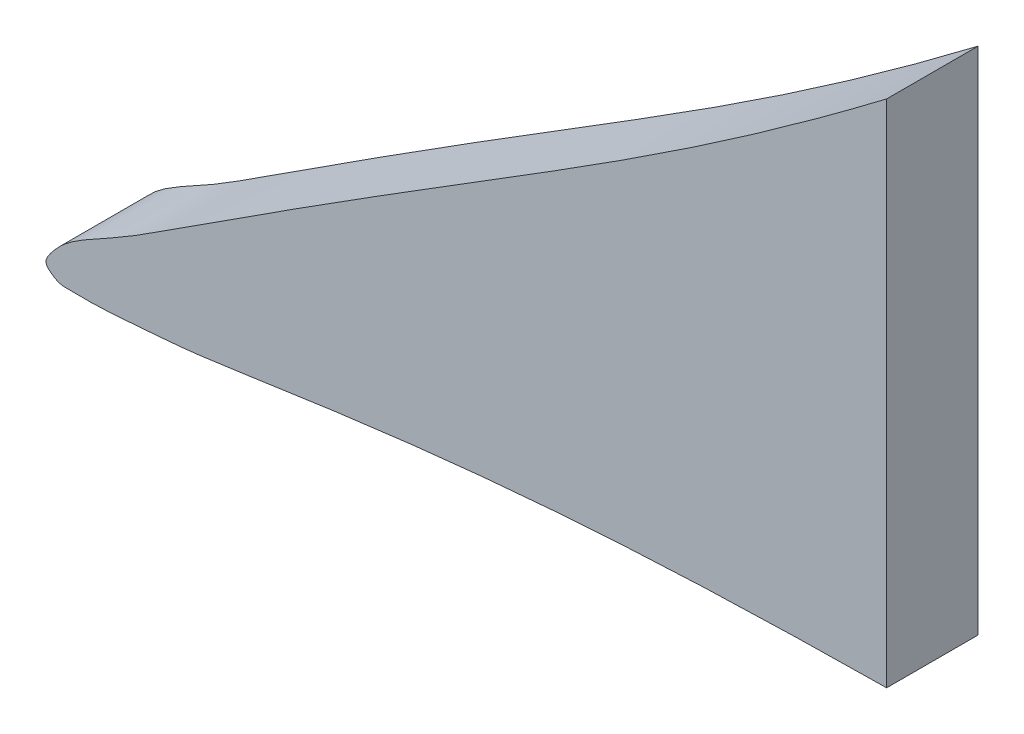
ISO-10303-21;
HEADER;
FILE_DESCRIPTION(('STEP AP214'),'2;1');
FILE_NAME('part.step','',(''),(''),'','','');
FILE_SCHEMA(('AUTOMOTIVE_DESIGN { 1 0 10303 214 1 1 1 1 }'));
ENDSEC;
DATA;
#1=APPLICATION_CONTEXT('core data for automotive mechanical design processes');
#2=APPLICATION_PROTOCOL_DEFINITION('international standard','automotive_design',2000,#1);
#3=PRODUCT_CONTEXT('',#1,'mechanical');
#4=PRODUCT('Part','Part','',(#3));
#5=PRODUCT_RELATED_PRODUCT_CATEGORY('part','',(#4));
#6=PRODUCT_DEFINITION_FORMATION('','',#4);
#7=PRODUCT_DEFINITION_CONTEXT('part definition',#1,'design');
#8=PRODUCT_DEFINITION('design','',#6,#7);
#9=PRODUCT_DEFINITION_SHAPE('','',#8);
#10=(LENGTH_UNIT() NAMED_UNIT(*) SI_UNIT(.MILLI.,.METRE.));
#11=(NAMED_UNIT(*) PLANE_ANGLE_UNIT() SI_UNIT($,.RADIAN.));
#12=(NAMED_UNIT(*) SI_UNIT($,.STERADIAN.) SOLID_ANGLE_UNIT());
#13=UNCERTAINTY_MEASURE_WITH_UNIT(LENGTH_MEASURE(1.E-05),#10,'distance_accuracy_value','');
#14=(GEOMETRIC_REPRESENTATION_CONTEXT(3) GLOBAL_UNCERTAINTY_ASSIGNED_CONTEXT((#13)) GLOBAL_UNIT_ASSIGNED_CONTEXT((#10,
#11,#12)) REPRESENTATION_CONTEXT('',''));
#15=CARTESIAN_POINT('',(0.,0.,0.));
#16=DIRECTION('',(0.,0.,1.));
#17=DIRECTION('',(1.,0.,0.));
#18=AXIS2_PLACEMENT_3D('',#15,#16,#17);
#19=CARTESIAN_POINT('',(-32.0968882556997,-73.8880275960974,83.9999999999997));
#20=CARTESIAN_POINT('',(-34.8026256233116,-75.9415499003159,83.9999999999997));
#21=CARTESIAN_POINT('',(-37.5344850546009,-77.9621587051084,83.9999999999997));
#22=CARTESIAN_POINT('',(-43.0533923084222,-81.9220186810204,83.9999999999997));
#23=CARTESIAN_POINT('',(-45.8398830041693,-83.8607202032387,83.9999999999997));
#24=CARTESIAN_POINT('',(-51.466282493583,-87.6566667024721,83.9999999999997));
#25=CARTESIAN_POINT('',(-54.3063776127079,-89.51362755428,83.9999999999997));
#26=CARTESIAN_POINT('',(-60.0249105196758,-93.1690810336559,83.9999999999997));
#27=CARTESIAN_POINT('',(-62.9034855714903,-94.9673643492238,83.9999999999997));
#28=CARTESIAN_POINT('',(-68.6668738120302,-98.5544185285678,83.9999999999997));
#29=CARTESIAN_POINT('',(-71.5515063133283,-100.343359043001,83.9999999999997));
#30=CARTESIAN_POINT('',(-77.3062560969179,-103.943879728018,83.9999999999997));
#31=CARTESIAN_POINT('',(-80.177233254649,-105.754382793048,83.9999999999997));
#32=CARTESIAN_POINT('',(-85.8976805132334,-109.409196176939,83.9999999999997));
#33=CARTESIAN_POINT('',(-88.7436636364401,-111.258805951937,83.9999999999997));
#34=CARTESIAN_POINT('',(-93.0225767041517,-114.0177477478,83.9999999999997));
#35=CARTESIAN_POINT('',(-94.4496351961372,-114.936152069158,83.9999999999997));
#36=CARTESIAN_POINT('',(-96.5869566353838,-116.31914690007,83.9999999999997));
#37=CARTESIAN_POINT('',(-97.2985865077974,-116.781483589216,83.9999999999997));
#38=CARTESIAN_POINT('',(-98.3814194488503,-117.449580928102,83.9999999999997));
#39=CARTESIAN_POINT('',(-98.7449138836085,-117.668069478261,83.9999999999997));
#40=CARTESIAN_POINT('',(-99.4785778862878,-118.09402511466,83.9999999999997));
#41=CARTESIAN_POINT('',(-99.848459337819,-118.301967916414,83.9999999999997));
#42=CARTESIAN_POINT('',(-100.961673771281,-118.9199016834,83.9999999999997));
#43=CARTESIAN_POINT('',(-101.71053009714,-119.32077293007,83.9999999999997));
#44=CARTESIAN_POINT('',(-103.167618594865,-120.189590886402,83.9999999999997));
#45=CARTESIAN_POINT('',(-103.877843997092,-120.663314564777,83.9999999999997));
#46=CARTESIAN_POINT('',(-104.780277435388,-121.543875965989,83.9999999999997));
#47=CARTESIAN_POINT('',(-105.060025676247,-121.863428181737,83.9999999999997));
#48=CARTESIAN_POINT('',(-105.376746629088,-122.289972129884,83.9999999999997));
#49=CARTESIAN_POINT('',(-105.438254843208,-122.376482657438,83.9999999999997));
#50=CARTESIAN_POINT('',(-105.553215667294,-122.554776506225,83.9999999999997));
#51=CARTESIAN_POINT('',(-105.607210330314,-122.646205026768,83.9999999999997));
#52=CARTESIAN_POINT('',(-105.694694649594,-122.84248361489,83.9999999999997));
#53=CARTESIAN_POINT('',(-105.727041923069,-122.947670974877,83.9999999999997));
#54=CARTESIAN_POINT('',(-105.724600073213,-123.107886456675,83.9999999999997));
#55=CARTESIAN_POINT('',(-105.71422746046,-123.161850310708,83.9999999999997));
#56=CARTESIAN_POINT('',(-105.677094958283,-123.261666642724,83.9999999999997));
#57=CARTESIAN_POINT('',(-105.651214502645,-123.307898755524,83.9999999999997));
#58=CARTESIAN_POINT('',(-105.559738519055,-123.439641940423,83.9999999999997));
#59=CARTESIAN_POINT('',(-105.482650927244,-123.515710719259,83.9999999999997));
#60=CARTESIAN_POINT('',(-105.320175989549,-123.655109358946,83.9999999999997));
#61=CARTESIAN_POINT('',(-105.234514507655,-123.718663638353,83.9999999999997));
#62=CARTESIAN_POINT('',(-104.970783863425,-123.899955875171,83.9999999999997));
#63=CARTESIAN_POINT('',(-104.783815559606,-124.00800385806,83.9999999999997));
#64=CARTESIAN_POINT('',(-104.483040633441,-124.10920145861,83.9999999999997));
#65=CARTESIAN_POINT('',(-104.377353339442,-124.131482567513,83.9999999999997));
#66=CARTESIAN_POINT('',(-104.164467838647,-124.157955307498,83.9999999999997));
#67=CARTESIAN_POINT('',(-104.05795373834,-124.162292994579,83.9999999999997));
#68=CARTESIAN_POINT('',(-103.738350834622,-124.167747740707,83.9999999999997));
#69=CARTESIAN_POINT('',(-103.525215559635,-124.163068915669,83.9999999999997));
#70=CARTESIAN_POINT('',(-102.885926588082,-124.16360626992,83.9999999999997));
#71=CARTESIAN_POINT('',(-102.459777426767,-124.169388081018,83.9999999999997));
#72=CARTESIAN_POINT('',(-101.607389940988,-124.16983137226,83.9999999999997));
#73=CARTESIAN_POINT('',(-101.180871969889,-124.161056646834,83.9999999999997));
#74=CARTESIAN_POINT('',(-99.9035816831706,-124.10268361038,83.9999999999997));
#75=CARTESIAN_POINT('',(-99.0542529778891,-124.033525703728,83.9999999999997));
#76=CARTESIAN_POINT('',(-97.3552145062371,-123.900452592421,83.9999999999997));
#77=CARTESIAN_POINT('',(-96.5057148546923,-123.833646592959,83.9999999999997));
#78=CARTESIAN_POINT('',(-94.8072997258953,-123.691997426722,83.9999999999997));
#79=CARTESIAN_POINT('',(-93.9584527723694,-123.615970753468,83.9999999999997));
#80=CARTESIAN_POINT('',(-91.4191673403087,-123.336359810731,83.9999999999997));
#81=CARTESIAN_POINT('',(-89.7344203016157,-123.089257858362,83.9999999999997));
#82=CARTESIAN_POINT('',(-86.3654025347054,-122.591489243336,83.9999999999997));
#83=CARTESIAN_POINT('',(-84.6810199703394,-122.341659563047,83.9999999999997));
#84=CARTESIAN_POINT('',(-79.6225862695498,-121.63173103357,83.9999999999997));
#85=CARTESIAN_POINT('',(-76.2448475135212,-121.193552881601,83.9999999999997));
#86=CARTESIAN_POINT('',(-66.0979720516532,-120.038155365336,83.9999999999997));
#87=CARTESIAN_POINT('',(-59.3139062826729,-119.494464233275,83.9999999999997));
#88=CARTESIAN_POINT('',(-49.1128481527221,-118.969202061428,83.9999999999997));
#89=CARTESIAN_POINT('',(-45.7103537696417,-118.842047788198,83.9999999999997));
#90=CARTESIAN_POINT('',(-38.9046471621787,-118.657261710584,83.9999999999997));
#91=CARTESIAN_POINT('',(-35.5009728924946,-118.599498804829,83.9999999999997));
#92=CARTESIAN_POINT('',(-32.0968882556782,-118.559046079052,83.9999999999997));
#93=B_SPLINE_CURVE_WITH_KNOTS('',3,(#19,#20,#21,#22,#23,#24,#25,#26,#27,#28,#29,#30,#31,#32,#33,
#34,#35,#36,#37,#38,#39,#40,#41,#42,#43,#44,#45,#46,#47,#48,#49,#50,#51,#52,#53,#54,#55,#56,#57,
#58,#59,#60,#61,#62,#63,#64,#65,#66,#67,#68,#69,#70,#71,#72,#73,#74,#75,#76,#77,#78,#79,#80,#81,
#82,#83,#84,#85,#86,#87,#88,#89,#90,#91,#92),.UNSPECIFIED.,.F.,.F.,(4,2,2,2,2,2,2,2,2,2,2,2,2,2,
2,2,2,2,2,2,2,2,2,2,2,2,2,2,2,2,2,2,2,2,2,2,4),(0.,0.0624999999999934,0.124999999999987,
0.187499999999981,0.249999999999974,0.312499999999968,0.374999999999961,0.437499999999955,
0.468749999999952,0.48437499999995,0.492187499999949,0.499999999999948,0.515624999999947,
0.531249999999945,0.539062499999944,0.541015624999944,0.542968749999944,0.544921874999944,
0.545898437499944,0.546874999999943,0.548828124999943,0.550781249999943,0.554687499999943,
0.556640624999943,0.558593749999944,0.562499999999944,0.570312499999945,0.578124999999946,
0.593749999999948,0.60937499999995,0.624999999999952,0.656249999999956,0.68749999999996,
0.749999999999968,0.874999999999984,0.937499999999992,1.),.UNSPECIFIED.);
#94=DIRECTION('',(0.,0.,-1.));
#95=VECTOR('',#94,1.);
#96=SURFACE_OF_LINEAR_EXTRUSION('',#93,#95);
#97=CARTESIAN_POINT('',(-32.0968882556997,-73.8880275960974,75.9999999999997));
#98=CARTESIAN_POINT('',(-34.8026256233116,-75.9415499003159,75.9999999999997));
#99=CARTESIAN_POINT('',(-37.5344850546009,-77.9621587051084,75.9999999999997));
#100=CARTESIAN_POINT('',(-43.0533923084222,-81.9220186810204,75.9999999999997));
#101=CARTESIAN_POINT('',(-45.8398830041693,-83.8607202032387,75.9999999999997));
#102=CARTESIAN_POINT('',(-51.466282493583,-87.6566667024721,75.9999999999997));
#103=CARTESIAN_POINT('',(-54.3063776127079,-89.51362755428,75.9999999999997));
#104=CARTESIAN_POINT('',(-60.0249105196758,-93.1690810336559,75.9999999999997));
#105=CARTESIAN_POINT('',(-62.9034855714903,-94.9673643492238,75.9999999999997));
#106=CARTESIAN_POINT('',(-68.6668738120302,-98.5544185285678,75.9999999999997));
#107=CARTESIAN_POINT('',(-71.5515063133283,-100.343359043001,75.9999999999997));
#108=CARTESIAN_POINT('',(-77.3062560969179,-103.943879728018,75.9999999999997));
#109=CARTESIAN_POINT('',(-80.177233254649,-105.754382793048,75.9999999999997));
#110=CARTESIAN_POINT('',(-85.8976805132334,-109.409196176939,75.9999999999997));
#111=CARTESIAN_POINT('',(-88.7436636364401,-111.258805951937,75.9999999999997));
#112=CARTESIAN_POINT('',(-93.0225767041517,-114.0177477478,75.9999999999997));
#113=CARTESIAN_POINT('',(-94.4496351961372,-114.936152069158,75.9999999999997));
#114=CARTESIAN_POINT('',(-96.5869566353838,-116.31914690007,75.9999999999997));
#115=CARTESIAN_POINT('',(-97.2985865077974,-116.781483589216,75.9999999999997));
#116=CARTESIAN_POINT('',(-98.3814194488503,-117.449580928102,75.9999999999997));
#117=CARTESIAN_POINT('',(-98.7449138836085,-117.668069478261,75.9999999999997));
#118=CARTESIAN_POINT('',(-99.4785778862878,-118.09402511466,75.9999999999997));
#119=CARTESIAN_POINT('',(-99.848459337819,-118.301967916414,75.9999999999997));
#120=CARTESIAN_POINT('',(-100.961673771281,-118.9199016834,75.9999999999997));
#121=CARTESIAN_POINT('',(-101.71053009714,-119.32077293007,75.9999999999997));
#122=CARTESIAN_POINT('',(-103.167618594865,-120.189590886402,75.9999999999997));
#123=CARTESIAN_POINT('',(-103.877843997092,-120.663314564777,75.9999999999997));
#124=CARTESIAN_POINT('',(-104.780277435388,-121.543875965989,75.9999999999997));
#125=CARTESIAN_POINT('',(-105.060025676247,-121.863428181737,75.9999999999997));
#126=CARTESIAN_POINT('',(-105.376746629088,-122.289972129884,75.9999999999997));
#127=CARTESIAN_POINT('',(-105.438254843208,-122.376482657438,75.9999999999997));
#128=CARTESIAN_POINT('',(-105.553215667294,-122.554776506225,75.9999999999997));
#129=CARTESIAN_POINT('',(-105.607210330314,-122.646205026768,75.9999999999997));
#130=CARTESIAN_POINT('',(-105.694694649594,-122.84248361489,75.9999999999997));
#131=CARTESIAN_POINT('',(-105.727041923069,-122.947670974877,75.9999999999997));
#132=CARTESIAN_POINT('',(-105.724600073213,-123.107886456675,75.9999999999997));
#133=CARTESIAN_POINT('',(-105.71422746046,-123.161850310708,75.9999999999997));
#134=CARTESIAN_POINT('',(-105.677094958283,-123.261666642724,75.9999999999997));
#135=CARTESIAN_POINT('',(-105.651214502645,-123.307898755524,75.9999999999997));
#136=CARTESIAN_POINT('',(-105.559738519055,-123.439641940423,75.9999999999997));
#137=CARTESIAN_POINT('',(-105.482650927244,-123.515710719259,75.9999999999997));
#138=CARTESIAN_POINT('',(-105.320175989549,-123.655109358946,75.9999999999997));
#139=CARTESIAN_POINT('',(-105.234514507655,-123.718663638353,75.9999999999997));
#140=CARTESIAN_POINT('',(-104.970783863425,-123.899955875171,75.9999999999997));
#141=CARTESIAN_POINT('',(-104.783815559606,-124.00800385806,75.9999999999997));
#142=CARTESIAN_POINT('',(-104.483040633441,-124.10920145861,75.9999999999997));
#143=CARTESIAN_POINT('',(-104.377353339442,-124.131482567513,75.9999999999997));
#144=CARTESIAN_POINT('',(-104.164467838647,-124.157955307498,75.9999999999997));
#145=CARTESIAN_POINT('',(-104.05795373834,-124.162292994579,75.9999999999997));
#146=CARTESIAN_POINT('',(-103.738350834622,-124.167747740707,75.9999999999997));
#147=CARTESIAN_POINT('',(-103.525215559635,-124.163068915669,75.9999999999997));
#148=CARTESIAN_POINT('',(-102.885926588082,-124.16360626992,75.9999999999997));
#149=CARTESIAN_POINT('',(-102.459777426767,-124.169388081018,75.9999999999997));
#150=CARTESIAN_POINT('',(-101.607389940988,-124.16983137226,75.9999999999997));
#151=CARTESIAN_POINT('',(-101.180871969889,-124.161056646834,75.9999999999997));
#152=CARTESIAN_POINT('',(-99.9035816831706,-124.10268361038,75.9999999999997));
#153=CARTESIAN_POINT('',(-99.0542529778891,-124.033525703728,75.9999999999997));
#154=CARTESIAN_POINT('',(-97.3552145062371,-123.900452592421,75.9999999999997));
#155=CARTESIAN_POINT('',(-96.5057148546923,-123.833646592959,75.9999999999997));
#156=CARTESIAN_POINT('',(-94.8072997258953,-123.691997426722,75.9999999999997));
#157=CARTESIAN_POINT('',(-93.9584527723694,-123.615970753468,75.9999999999997));
#158=CARTESIAN_POINT('',(-91.4191673403087,-123.336359810731,75.9999999999997));
#159=CARTESIAN_POINT('',(-89.7344203016157,-123.089257858362,75.9999999999997));
#160=CARTESIAN_POINT('',(-86.3654025347054,-122.591489243336,75.9999999999997));
#161=CARTESIAN_POINT('',(-84.6810199703394,-122.341659563047,75.9999999999997));
#162=CARTESIAN_POINT('',(-79.6225862695498,-121.63173103357,75.9999999999997));
#163=CARTESIAN_POINT('',(-76.2448475135212,-121.193552881601,75.9999999999997));
#164=CARTESIAN_POINT('',(-66.0979720516532,-120.038155365336,75.9999999999997));
#165=CARTESIAN_POINT('',(-59.3139062826729,-119.494464233275,75.9999999999997));
#166=CARTESIAN_POINT('',(-49.1128481527221,-118.969202061428,75.9999999999997));
#167=CARTESIAN_POINT('',(-45.7103537696417,-118.842047788198,75.9999999999997));
#168=CARTESIAN_POINT('',(-38.9046471621787,-118.657261710584,75.9999999999997));
#169=CARTESIAN_POINT('',(-35.5009728924946,-118.599498804829,75.9999999999997));
#170=CARTESIAN_POINT('',(-32.0968882556782,-118.559046079052,75.9999999999997));
#171=B_SPLINE_CURVE_WITH_KNOTS('',3,(#97,#98,#99,#100,#101,#102,#103,#104,#105,#106,#107,#108,
#109,#110,#111,#112,#113,#114,#115,#116,#117,#118,#119,#120,#121,#122,#123,#124,#125,#126,#127,
#128,#129,#130,#131,#132,#133,#134,#135,#136,#137,#138,#139,#140,#141,#142,#143,#144,#145,#146,
#147,#148,#149,#150,#151,#152,#153,#154,#155,#156,#157,#158,#159,#160,#161,#162,#163,#164,#165,
#166,#167,#168,#169,#170),.UNSPECIFIED.,.F.,.F.,(4,2,2,2,2,2,2,2,2,2,2,2,2,2,2,2,2,2,2,2,2,2,2,
2,2,2,2,2,2,2,2,2,2,2,2,2,4),(0.,0.0624999999999934,0.124999999999987,0.187499999999981,
0.249999999999974,0.312499999999968,0.374999999999961,0.437499999999955,0.468749999999952,
0.48437499999995,0.492187499999949,0.499999999999948,0.515624999999947,0.531249999999945,
0.539062499999944,0.541015624999944,0.542968749999944,0.544921874999944,0.545898437499944,
0.546874999999943,0.548828124999943,0.550781249999943,0.554687499999943,0.556640624999943,
0.558593749999944,0.562499999999944,0.570312499999945,0.578124999999946,0.593749999999948,
0.60937499999995,0.624999999999952,0.656249999999956,0.68749999999996,0.749999999999968,
0.874999999999984,0.937499999999992,1.),.UNSPECIFIED.);
#172=CARTESIAN_POINT('',(-32.0968882556661,-73.8880275960717,75.9999999999997));
#173=VERTEX_POINT('',#172);
#174=CARTESIAN_POINT('',(-32.0968882556783,-118.559046079052,75.9999999999997));
#175=VERTEX_POINT('',#174);
#176=EDGE_CURVE('E65',#173,#175,#171,.T.);
#177=ORIENTED_EDGE('',*,*,#176,.T.);
#178=DIRECTION('',(0.,0.,-1.));
#179=VECTOR('',#178,1.);
#180=CARTESIAN_POINT('',(-32.0968882556783,-118.559046079052,83.9999999999997));
#181=LINE('',#180,#179);
#182=CARTESIAN_POINT('',(-32.0968882556783,-118.559046079052,83.9999999999997));
#183=VERTEX_POINT('',#182);
#184=EDGE_CURVE('E11',#183,#175,#181,.T.);
#185=ORIENTED_EDGE('',*,*,#184,.F.);
#186=CARTESIAN_POINT('',(-32.0968882556782,-118.559046079052,83.9999999999997));
#187=CARTESIAN_POINT('',(-35.5009728924946,-118.599498804829,83.9999999999997));
#188=CARTESIAN_POINT('',(-38.9046471621787,-118.657261710584,83.9999999999997));
#189=CARTESIAN_POINT('',(-45.7103537696417,-118.842047788198,83.9999999999997));
#190=CARTESIAN_POINT('',(-49.1128481527221,-118.969202061428,83.9999999999997));
#191=CARTESIAN_POINT('',(-59.3139062826729,-119.494464233275,83.9999999999997));
#192=CARTESIAN_POINT('',(-66.0979720516532,-120.038155365336,83.9999999999997));
#193=CARTESIAN_POINT('',(-76.2448475135212,-121.193552881601,83.9999999999997));
#194=CARTESIAN_POINT('',(-79.6225862695498,-121.63173103357,83.9999999999997));
#195=CARTESIAN_POINT('',(-84.6810199703394,-122.341659563047,83.9999999999997));
#196=CARTESIAN_POINT('',(-86.3654025347054,-122.591489243336,83.9999999999997));
#197=CARTESIAN_POINT('',(-89.7344203016157,-123.089257858362,83.9999999999997));
#198=CARTESIAN_POINT('',(-91.4191673403087,-123.336359810731,83.9999999999997));
#199=CARTESIAN_POINT('',(-93.9584527723694,-123.615970753468,83.9999999999997));
#200=CARTESIAN_POINT('',(-94.8072997258953,-123.691997426722,83.9999999999997));
#201=CARTESIAN_POINT('',(-96.5057148546923,-123.833646592959,83.9999999999997));
#202=CARTESIAN_POINT('',(-97.3552145062371,-123.900452592421,83.9999999999997));
#203=CARTESIAN_POINT('',(-99.0542529778891,-124.033525703728,83.9999999999997));
#204=CARTESIAN_POINT('',(-99.9035816831706,-124.10268361038,83.9999999999997));
#205=CARTESIAN_POINT('',(-101.180871969889,-124.161056646834,83.9999999999997));
#206=CARTESIAN_POINT('',(-101.607389940988,-124.16983137226,83.9999999999997));
#207=CARTESIAN_POINT('',(-102.459777426767,-124.169388081018,83.9999999999997));
#208=CARTESIAN_POINT('',(-102.885926588082,-124.16360626992,83.9999999999997));
#209=CARTESIAN_POINT('',(-103.525215559635,-124.163068915669,83.9999999999997));
#210=CARTESIAN_POINT('',(-103.738350834622,-124.167747740707,83.9999999999997));
#211=CARTESIAN_POINT('',(-104.05795373834,-124.162292994579,83.9999999999997));
#212=CARTESIAN_POINT('',(-104.164467838647,-124.157955307498,83.9999999999997));
#213=CARTESIAN_POINT('',(-104.377353339442,-124.131482567513,83.9999999999997));
#214=CARTESIAN_POINT('',(-104.483040633441,-124.10920145861,83.9999999999997));
#215=CARTESIAN_POINT('',(-104.783815559606,-124.00800385806,83.9999999999997));
#216=CARTESIAN_POINT('',(-104.970783863425,-123.899955875171,83.9999999999997));
#217=CARTESIAN_POINT('',(-105.234514507655,-123.718663638353,83.9999999999997));
#218=CARTESIAN_POINT('',(-105.320175989549,-123.655109358946,83.9999999999997));
#219=CARTESIAN_POINT('',(-105.482650927244,-123.515710719259,83.9999999999997));
#220=CARTESIAN_POINT('',(-105.559738519055,-123.439641940423,83.9999999999997));
#221=CARTESIAN_POINT('',(-105.651214502645,-123.307898755524,83.9999999999997));
#222=CARTESIAN_POINT('',(-105.677094958283,-123.261666642724,83.9999999999997));
#223=CARTESIAN_POINT('',(-105.71422746046,-123.161850310708,83.9999999999997));
#224=CARTESIAN_POINT('',(-105.724600073213,-123.107886456675,83.9999999999997));
#225=CARTESIAN_POINT('',(-105.727041923069,-122.947670974877,83.9999999999997));
#226=CARTESIAN_POINT('',(-105.694694649594,-122.84248361489,83.9999999999997));
#227=CARTESIAN_POINT('',(-105.607210330314,-122.646205026768,83.9999999999997));
#228=CARTESIAN_POINT('',(-105.553215667294,-122.554776506225,83.9999999999997));
#229=CARTESIAN_POINT('',(-105.438254843208,-122.376482657438,83.9999999999997));
#230=CARTESIAN_POINT('',(-105.376746629088,-122.289972129884,83.9999999999997));
#231=CARTESIAN_POINT('',(-105.060025676247,-121.863428181737,83.9999999999997));
#232=CARTESIAN_POINT('',(-104.780277435388,-121.543875965989,83.9999999999997));
#233=CARTESIAN_POINT('',(-103.877843997092,-120.663314564777,83.9999999999997));
#234=CARTESIAN_POINT('',(-103.167618594865,-120.189590886402,83.9999999999997));
#235=CARTESIAN_POINT('',(-101.71053009714,-119.32077293007,83.9999999999997));
#236=CARTESIAN_POINT('',(-100.961673771281,-118.9199016834,83.9999999999997));
#237=CARTESIAN_POINT('',(-99.848459337819,-118.301967916414,83.9999999999997));
#238=CARTESIAN_POINT('',(-99.4785778862878,-118.09402511466,83.9999999999997));
#239=CARTESIAN_POINT('',(-98.7449138836085,-117.668069478261,83.9999999999997));
#240=CARTESIAN_POINT('',(-98.3814194488503,-117.449580928102,83.9999999999997));
#241=CARTESIAN_POINT('',(-97.2985865077974,-116.781483589216,83.9999999999997));
#242=CARTESIAN_POINT('',(-96.5869566353838,-116.31914690007,83.9999999999997));
#243=CARTESIAN_POINT('',(-94.4496351961372,-114.936152069158,83.9999999999997));
#244=CARTESIAN_POINT('',(-93.0225767041517,-114.0177477478,83.9999999999997));
#245=CARTESIAN_POINT('',(-88.7436636364401,-111.258805951937,83.9999999999997));
#246=CARTESIAN_POINT('',(-85.8976805132334,-109.409196176939,83.9999999999997));
#247=CARTESIAN_POINT('',(-80.177233254649,-105.754382793048,83.9999999999997));
#248=CARTESIAN_POINT('',(-77.3062560969179,-103.943879728018,83.9999999999997));
#249=CARTESIAN_POINT('',(-71.5515063133283,-100.343359043001,83.9999999999997));
#250=CARTESIAN_POINT('',(-68.6668738120302,-98.5544185285678,83.9999999999997));
#251=CARTESIAN_POINT('',(-62.9034855714903,-94.9673643492238,83.9999999999997));
#252=CARTESIAN_POINT('',(-60.0249105196758,-93.1690810336559,83.9999999999997));
#253=CARTESIAN_POINT('',(-54.3063776127079,-89.51362755428,83.9999999999997));
#254=CARTESIAN_POINT('',(-51.466282493583,-87.6566667024721,83.9999999999997));
#255=CARTESIAN_POINT('',(-45.8398830041693,-83.8607202032387,83.9999999999997));
#256=CARTESIAN_POINT('',(-43.0533923084222,-81.9220186810204,83.9999999999997));
#257=CARTESIAN_POINT('',(-37.5344850546009,-77.9621587051084,83.9999999999997));
#258=CARTESIAN_POINT('',(-34.8026256233116,-75.9415499003159,83.9999999999997));
#259=CARTESIAN_POINT('',(-32.0968882556997,-73.8880275960974,83.9999999999997));
#260=B_SPLINE_CURVE_WITH_KNOTS('',3,(#186,#187,#188,#189,#190,#191,#192,#193,#194,#195,#196,
#197,#198,#199,#200,#201,#202,#203,#204,#205,#206,#207,#208,#209,#210,#211,#212,#213,#214,#215,
#216,#217,#218,#219,#220,#221,#222,#223,#224,#225,#226,#227,#228,#229,#230,#231,#232,#233,#234,
#235,#236,#237,#238,#239,#240,#241,#242,#243,#244,#245,#246,#247,#248,#249,#250,#251,#252,#253,
#254,#255,#256,#257,#258,#259),.UNSPECIFIED.,.F.,.F.,(4,2,2,2,2,2,2,2,2,2,2,2,2,2,2,2,2,2,2,2,2,
2,2,2,2,2,2,2,2,2,2,2,2,2,2,2,4),(0.,0.062500000000008,0.125000000000016,0.250000000000032,
0.31250000000004,0.343750000000044,0.375000000000048,0.39062500000005,0.406250000000052,
0.421875000000054,0.429687500000055,0.437500000000056,0.441406250000056,0.443359375000057,
0.445312500000057,0.449218750000057,0.451171875000057,0.453125000000057,0.454101562500056,
0.455078125000056,0.457031250000056,0.458984375000056,0.460937500000056,0.468750000000055,
0.484375000000053,0.500000000000052,0.507812500000051,0.51562500000005,0.531250000000048,
0.562500000000045,0.625000000000039,0.687500000000032,0.750000000000026,0.812500000000019,
0.875000000000013,0.937500000000007,1.),.UNSPECIFIED.);
#261=CARTESIAN_POINT('',(-32.0968882556661,-73.8880275960717,83.9999999999997));
#262=VERTEX_POINT('',#261);
#263=EDGE_CURVE('E64',#262,#183,#260,.F.);
#264=ORIENTED_EDGE('',*,*,#263,.F.);
#265=DIRECTION('',(0.,0.,-1.));
#266=VECTOR('',#265,1.);
#267=CARTESIAN_POINT('',(-32.0968882556661,-73.8880275960717,83.9999999999997));
#268=LINE('',#267,#266);
#269=EDGE_CURVE('E41',#262,#173,#268,.T.);
#270=ORIENTED_EDGE('',*,*,#269,.T.);
#271=EDGE_LOOP('',(#177,#185,#264,#270));
#272=FACE_BOUND('',#271,.T.);
#273=ADVANCED_FACE('F30',(#272),#96,.F.);
#274=CARTESIAN_POINT('',(-32.0968882556661,-73.8880275960717,83.9999999999997));
#275=DIRECTION('',(-1.,2.72454497810259E-13,0.));
#276=DIRECTION('',(-2.72454497810259E-13,-1.,0.));
#277=AXIS2_PLACEMENT_3D('',#274,#275,#276);
#278=PLANE('',#277);
#279=DIRECTION('',(2.72454497810259E-13,1.,0.));
#280=VECTOR('',#279,1.);
#281=CARTESIAN_POINT('',(-32.0968882556661,-73.8880275960717,75.9999999999997));
#282=LINE('',#281,#280);
#283=EDGE_CURVE('E57',#175,#173,#282,.T.);
#284=ORIENTED_EDGE('',*,*,#283,.T.);
#285=ORIENTED_EDGE('',*,*,#269,.F.);
#286=DIRECTION('',(2.72454497810259E-13,1.,0.));
#287=VECTOR('',#286,1.);
#288=CARTESIAN_POINT('',(-32.0968882556661,-73.8880275960717,83.9999999999997));
#289=LINE('',#288,#287);
#290=EDGE_CURVE('E49',#183,#262,#289,.T.);
#291=ORIENTED_EDGE('',*,*,#290,.F.);
#292=ORIENTED_EDGE('',*,*,#184,.T.);
#293=EDGE_LOOP('',(#284,#285,#291,#292));
#294=FACE_BOUND('',#293,.T.);
#295=ADVANCED_FACE('F60',(#294),#278,.F.);
#296=CARTESIAN_POINT('',(-100.219530815647,-118.507945838747,83.9999999999997));
#297=DIRECTION('',(0.,0.,-1.));
#298=DIRECTION('',(-1.,0.,0.));
#299=AXIS2_PLACEMENT_3D('',#296,#297,#298);
#300=PLANE('',#299);
#301=ORIENTED_EDGE('',*,*,#263,.T.);
#302=ORIENTED_EDGE('',*,*,#290,.T.);
#303=EDGE_LOOP('',(#301,#302));
#304=FACE_BOUND('',#303,.T.);
#305=ADVANCED_FACE('F87',(#304),#300,.F.);
#306=CARTESIAN_POINT('',(-100.219530815647,-118.507945838747,75.9999999999997));
#307=DIRECTION('',(0.,0.,-1.));
#308=DIRECTION('',(-1.,0.,0.));
#309=AXIS2_PLACEMENT_3D('',#306,#307,#308);
#310=PLANE('',#309);
#311=ORIENTED_EDGE('',*,*,#176,.F.);
#312=ORIENTED_EDGE('',*,*,#283,.F.);
#313=EDGE_LOOP('',(#311,#312));
#314=FACE_BOUND('',#313,.T.);
#315=ADVANCED_FACE('F71',(#314),#310,.T.);
#316=CLOSED_SHELL('',(#273,#295,#305,#315));
#317=MANIFOLD_SOLID_BREP('B2',#316);
#318=ADVANCED_BREP_SHAPE_REPRESENTATION('',(#18,#317),#14);
#319=SHAPE_DEFINITION_REPRESENTATION(#9,#318);
ENDSEC;
END-ISO-10303-21;
